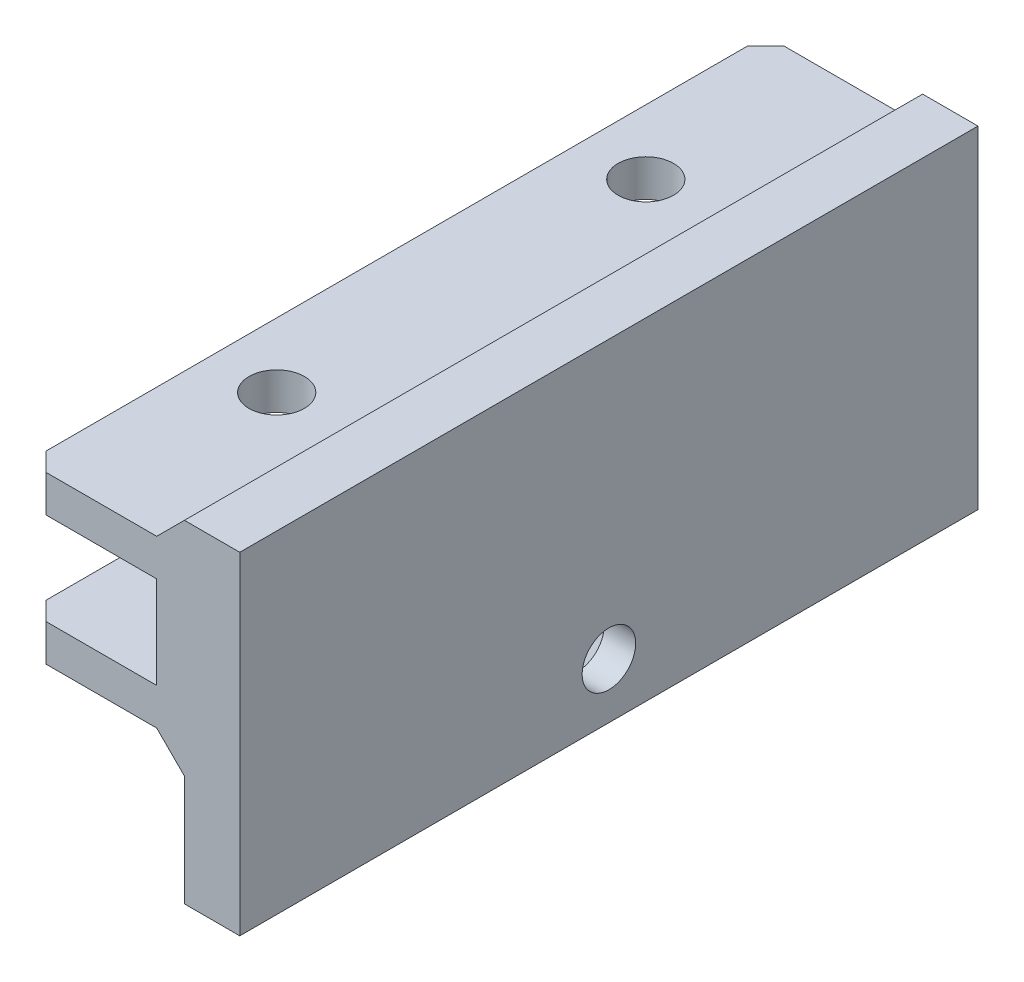
ISO-10303-21;
HEADER;
FILE_DESCRIPTION(('STEP AP214'),'2;1');
FILE_NAME('part.step','',(''),(''),'','','');
FILE_SCHEMA(('AUTOMOTIVE_DESIGN { 1 0 10303 214 1 1 1 1 }'));
ENDSEC;
DATA;
#1=APPLICATION_CONTEXT('core data for automotive mechanical design processes');
#2=APPLICATION_PROTOCOL_DEFINITION('international standard','automotive_design',2000,#1);
#3=PRODUCT_CONTEXT('',#1,'mechanical');
#4=PRODUCT('Part','Part','',(#3));
#5=PRODUCT_RELATED_PRODUCT_CATEGORY('part','',(#4));
#6=PRODUCT_DEFINITION_FORMATION('','',#4);
#7=PRODUCT_DEFINITION_CONTEXT('part definition',#1,'design');
#8=PRODUCT_DEFINITION('design','',#6,#7);
#9=PRODUCT_DEFINITION_SHAPE('','',#8);
#10=(LENGTH_UNIT() NAMED_UNIT(*) SI_UNIT(.MILLI.,.METRE.));
#11=(NAMED_UNIT(*) PLANE_ANGLE_UNIT() SI_UNIT($,.RADIAN.));
#12=(NAMED_UNIT(*) SI_UNIT($,.STERADIAN.) SOLID_ANGLE_UNIT());
#13=UNCERTAINTY_MEASURE_WITH_UNIT(LENGTH_MEASURE(1.E-05),#10,'distance_accuracy_value','');
#14=(GEOMETRIC_REPRESENTATION_CONTEXT(3) GLOBAL_UNCERTAINTY_ASSIGNED_CONTEXT((#13)) GLOBAL_UNIT_ASSIGNED_CONTEXT((#10,
#11,#12)) REPRESENTATION_CONTEXT('',''));
#15=CARTESIAN_POINT('',(0.,0.,0.));
#16=DIRECTION('',(0.,0.,1.));
#17=DIRECTION('',(1.,0.,0.));
#18=AXIS2_PLACEMENT_3D('',#15,#16,#17);
#19=CARTESIAN_POINT('',(0.,6.,20.));
#20=DIRECTION('',(0.,-1.,0.));
#21=DIRECTION('',(0.,0.,-1.));
#22=AXIS2_PLACEMENT_3D('',#19,#20,#21);
#23=PLANE('',#22);
#24=DIRECTION('',(-1.,0.,0.));
#25=VECTOR('',#24,1.);
#26=CARTESIAN_POINT('',(0.,6.,-20.));
#27=LINE('',#26,#25);
#28=CARTESIAN_POINT('',(0.,6.,-20.));
#29=VERTEX_POINT('',#28);
#30=CARTESIAN_POINT('',(-3.00000000000001,6.,-20.));
#31=VERTEX_POINT('',#30);
#32=EDGE_CURVE('E233',#29,#31,#27,.T.);
#33=ORIENTED_EDGE('',*,*,#32,.T.);
#34=DIRECTION('',(0.,0.,-1.));
#35=VECTOR('',#34,1.);
#36=CARTESIAN_POINT('',(-3.00000000000001,6.,20.));
#37=LINE('',#36,#35);
#38=CARTESIAN_POINT('',(-3.00000000000001,6.,20.));
#39=VERTEX_POINT('',#38);
#40=EDGE_CURVE('E329',#39,#31,#37,.T.);
#41=ORIENTED_EDGE('',*,*,#40,.F.);
#42=DIRECTION('',(-1.,0.,0.));
#43=VECTOR('',#42,1.);
#44=CARTESIAN_POINT('',(0.,6.,20.));
#45=LINE('',#44,#43);
#46=CARTESIAN_POINT('',(0.,6.,20.));
#47=VERTEX_POINT('',#46);
#48=EDGE_CURVE('E234',#47,#39,#45,.T.);
#49=ORIENTED_EDGE('',*,*,#48,.F.);
#50=DIRECTION('',(0.,0.,-1.));
#51=VECTOR('',#50,1.);
#52=CARTESIAN_POINT('',(0.,6.,20.));
#53=LINE('',#52,#51);
#54=EDGE_CURVE('E263',#47,#29,#53,.T.);
#55=ORIENTED_EDGE('',*,*,#54,.T.);
#56=EDGE_LOOP('',(#33,#41,#49,#55));
#57=FACE_BOUND('',#56,.T.);
#58=ADVANCED_FACE('F47',(#57),#23,.F.);
#59=CARTESIAN_POINT('',(-3.00000000000001,6.,20.));
#60=DIRECTION('',(0.707106781186549,-0.707106781186546,0.));
#61=DIRECTION('',(0.707106781186546,0.707106781186549,0.));
#62=AXIS2_PLACEMENT_3D('',#59,#60,#61);
#63=PLANE('',#62);
#64=DIRECTION('',(-0.707106781186546,-0.707106781186549,0.));
#65=VECTOR('',#64,1.);
#66=CARTESIAN_POINT('',(-3.00000000000001,6.,-20.));
#67=LINE('',#66,#65);
#68=CARTESIAN_POINT('',(-4.5,4.5,-20.));
#69=VERTEX_POINT('',#68);
#70=EDGE_CURVE('E267',#31,#69,#67,.T.);
#71=ORIENTED_EDGE('',*,*,#70,.T.);
#72=DIRECTION('',(0.,0.,-1.));
#73=VECTOR('',#72,1.);
#74=CARTESIAN_POINT('',(-4.5,4.5,20.));
#75=LINE('',#74,#73);
#76=CARTESIAN_POINT('',(-4.5,4.5,20.));
#77=VERTEX_POINT('',#76);
#78=EDGE_CURVE('E325',#77,#69,#75,.T.);
#79=ORIENTED_EDGE('',*,*,#78,.F.);
#80=DIRECTION('',(-0.707106781186546,-0.707106781186549,0.));
#81=VECTOR('',#80,1.);
#82=CARTESIAN_POINT('',(-3.00000000000001,6.,20.));
#83=LINE('',#82,#81);
#84=EDGE_CURVE('E238',#39,#77,#83,.T.);
#85=ORIENTED_EDGE('',*,*,#84,.F.);
#86=ORIENTED_EDGE('',*,*,#40,.T.);
#87=EDGE_LOOP('',(#71,#79,#85,#86));
#88=FACE_BOUND('',#87,.T.);
#89=ADVANCED_FACE('F428',(#88),#63,.F.);
#90=CARTESIAN_POINT('',(-4.5,4.5,20.));
#91=DIRECTION('',(0.,-1.,0.));
#92=DIRECTION('',(0.,0.,-1.));
#93=AXIS2_PLACEMENT_3D('',#90,#91,#92);
#94=PLANE('',#93);
#95=CARTESIAN_POINT('',(-8.,4.5,10.));
#96=DIRECTION('',(0.,1.,0.));
#97=DIRECTION('',(0.,0.,1.));
#98=AXIS2_PLACEMENT_3D('',#95,#96,#97);
#99=CIRCLE('',#98,1.5);
#100=CARTESIAN_POINT('',(-8.,4.5,11.5));
#101=VERTEX_POINT('',#100);
#102=EDGE_CURVE('E201',#101,#101,#99,.T.);
#103=ORIENTED_EDGE('',*,*,#102,.F.);
#104=EDGE_LOOP('',(#103));
#105=FACE_BOUND('',#104,.T.);
#106=CARTESIAN_POINT('',(-8.,4.5,-10.));
#107=DIRECTION('',(0.,1.,0.));
#108=DIRECTION('',(0.,0.,1.));
#109=AXIS2_PLACEMENT_3D('',#106,#107,#108);
#110=CIRCLE('',#109,1.5);
#111=CARTESIAN_POINT('',(-8.,4.5,-8.5));
#112=VERTEX_POINT('',#111);
#113=EDGE_CURVE('E220',#112,#112,#110,.T.);
#114=ORIENTED_EDGE('',*,*,#113,.F.);
#115=EDGE_LOOP('',(#114));
#116=FACE_BOUND('',#115,.T.);
#117=DIRECTION('',(-1.,0.,0.));
#118=VECTOR('',#117,1.);
#119=CARTESIAN_POINT('',(-4.5,4.5,-20.));
#120=LINE('',#119,#118);
#121=CARTESIAN_POINT('',(-10.5,4.5,-20.));
#122=VERTEX_POINT('',#121);
#123=EDGE_CURVE('E270',#69,#122,#120,.T.);
#124=ORIENTED_EDGE('',*,*,#123,.T.);
#125=DIRECTION('',(0.707106781186548,0.,-0.707106781186548));
#126=VECTOR('',#125,1.);
#127=CARTESIAN_POINT('',(-11.5,4.5,-19.));
#128=LINE('',#127,#126);
#129=CARTESIAN_POINT('',(-11.5,4.5,-19.));
#130=VERTEX_POINT('',#129);
#131=EDGE_CURVE('E378',#122,#130,#128,.F.);
#132=ORIENTED_EDGE('',*,*,#131,.T.);
#133=DIRECTION('',(0.,0.,-1.));
#134=VECTOR('',#133,1.);
#135=CARTESIAN_POINT('',(-11.5,4.5,20.));
#136=LINE('',#135,#134);
#137=CARTESIAN_POINT('',(-11.5,4.5,19.));
#138=VERTEX_POINT('',#137);
#139=EDGE_CURVE('E321',#138,#130,#136,.T.);
#140=ORIENTED_EDGE('',*,*,#139,.F.);
#141=DIRECTION('',(0.707106781186548,0.,0.707106781186548));
#142=VECTOR('',#141,1.);
#143=CARTESIAN_POINT('',(-10.5,4.5,20.));
#144=LINE('',#143,#142);
#145=CARTESIAN_POINT('',(-10.5,4.5,20.));
#146=VERTEX_POINT('',#145);
#147=EDGE_CURVE('E64',#138,#146,#144,.T.);
#148=ORIENTED_EDGE('',*,*,#147,.T.);
#149=DIRECTION('',(-1.,0.,0.));
#150=VECTOR('',#149,1.);
#151=CARTESIAN_POINT('',(-4.5,4.5,20.));
#152=LINE('',#151,#150);
#153=EDGE_CURVE('E241',#77,#146,#152,.T.);
#154=ORIENTED_EDGE('',*,*,#153,.F.);
#155=ORIENTED_EDGE('',*,*,#78,.T.);
#156=EDGE_LOOP('',(#124,#132,#140,#148,#154,#155));
#157=FACE_BOUND('',#156,.T.);
#158=ADVANCED_FACE('F434',(#105,#116,#157),#94,.F.);
#159=CARTESIAN_POINT('',(-11.5,4.5,20.));
#160=DIRECTION('',(1.,0.,0.));
#161=DIRECTION('',(0.,0.,-1.));
#162=AXIS2_PLACEMENT_3D('',#159,#160,#161);
#163=PLANE('',#162);
#164=ORIENTED_EDGE('',*,*,#139,.T.);
#165=DIRECTION('',(0.,-1.,0.));
#166=VECTOR('',#165,1.);
#167=CARTESIAN_POINT('',(-11.5,4.5,-19.));
#168=LINE('',#167,#166);
#169=CARTESIAN_POINT('',(-11.5,2.5,-19.));
#170=VERTEX_POINT('',#169);
#171=EDGE_CURVE('E367',#130,#170,#168,.T.);
#172=ORIENTED_EDGE('',*,*,#171,.T.);
#173=DIRECTION('',(0.,0.,-1.));
#174=VECTOR('',#173,1.);
#175=CARTESIAN_POINT('',(-11.5,2.5,20.));
#176=LINE('',#175,#174);
#177=CARTESIAN_POINT('',(-11.5,2.5,19.));
#178=VERTEX_POINT('',#177);
#179=EDGE_CURVE('E317',#178,#170,#176,.T.);
#180=ORIENTED_EDGE('',*,*,#179,.F.);
#181=DIRECTION('',(0.,1.,0.));
#182=VECTOR('',#181,1.);
#183=CARTESIAN_POINT('',(-11.5,4.5,19.));
#184=LINE('',#183,#182);
#185=EDGE_CURVE('E364',#178,#138,#184,.T.);
#186=ORIENTED_EDGE('',*,*,#185,.T.);
#187=EDGE_LOOP('',(#164,#172,#180,#186));
#188=FACE_BOUND('',#187,.T.);
#189=ADVANCED_FACE('F485',(#188),#163,.F.);
#190=CARTESIAN_POINT('',(-4.5,2.5,20.));
#191=DIRECTION('',(0.,1.,0.));
#192=DIRECTION('',(0.,0.,1.));
#193=AXIS2_PLACEMENT_3D('',#190,#191,#192);
#194=PLANE('',#193);
#195=CARTESIAN_POINT('',(-8.,2.5,10.));
#196=DIRECTION('',(0.,1.,0.));
#197=DIRECTION('',(0.,0.,1.));
#198=AXIS2_PLACEMENT_3D('',#195,#196,#197);
#199=CIRCLE('',#198,1.5);
#200=CARTESIAN_POINT('',(-8.,2.5,11.5));
#201=VERTEX_POINT('',#200);
#202=EDGE_CURVE('E216',#201,#201,#199,.T.);
#203=ORIENTED_EDGE('',*,*,#202,.T.);
#204=EDGE_LOOP('',(#203));
#205=FACE_BOUND('',#204,.T.);
#206=CARTESIAN_POINT('',(-8.,2.5,-10.));
#207=DIRECTION('',(0.,1.,0.));
#208=DIRECTION('',(0.,0.,1.));
#209=AXIS2_PLACEMENT_3D('',#206,#207,#208);
#210=CIRCLE('',#209,1.5);
#211=CARTESIAN_POINT('',(-8.,2.5,-8.5));
#212=VERTEX_POINT('',#211);
#213=EDGE_CURVE('E229',#212,#212,#210,.T.);
#214=ORIENTED_EDGE('',*,*,#213,.T.);
#215=EDGE_LOOP('',(#214));
#216=FACE_BOUND('',#215,.T.);
#217=ORIENTED_EDGE('',*,*,#179,.T.);
#218=DIRECTION('',(-0.707106781186548,0.,0.707106781186548));
#219=VECTOR('',#218,1.);
#220=CARTESIAN_POINT('',(-11.5,2.5,-19.));
#221=LINE('',#220,#219);
#222=CARTESIAN_POINT('',(-10.5,2.5,-20.));
#223=VERTEX_POINT('',#222);
#224=EDGE_CURVE('E373',#170,#223,#221,.F.);
#225=ORIENTED_EDGE('',*,*,#224,.T.);
#226=DIRECTION('',(1.,0.,0.));
#227=VECTOR('',#226,1.);
#228=CARTESIAN_POINT('',(-4.5,2.5,-20.));
#229=LINE('',#228,#227);
#230=CARTESIAN_POINT('',(-4.5,2.5,-20.));
#231=VERTEX_POINT('',#230);
#232=EDGE_CURVE('E274',#223,#231,#229,.T.);
#233=ORIENTED_EDGE('',*,*,#232,.T.);
#234=DIRECTION('',(0.,0.,-1.));
#235=VECTOR('',#234,1.);
#236=CARTESIAN_POINT('',(-4.5,2.5,20.));
#237=LINE('',#236,#235);
#238=CARTESIAN_POINT('',(-4.5,2.5,20.));
#239=VERTEX_POINT('',#238);
#240=EDGE_CURVE('E313',#239,#231,#237,.T.);
#241=ORIENTED_EDGE('',*,*,#240,.F.);
#242=DIRECTION('',(1.,0.,0.));
#243=VECTOR('',#242,1.);
#244=CARTESIAN_POINT('',(-4.5,2.5,20.));
#245=LINE('',#244,#243);
#246=CARTESIAN_POINT('',(-10.5,2.5,20.));
#247=VERTEX_POINT('',#246);
#248=EDGE_CURVE('E244',#247,#239,#245,.T.);
#249=ORIENTED_EDGE('',*,*,#248,.F.);
#250=DIRECTION('',(-0.707106781186548,0.,-0.707106781186548));
#251=VECTOR('',#250,1.);
#252=CARTESIAN_POINT('',(-10.5,2.5,20.));
#253=LINE('',#252,#251);
#254=EDGE_CURVE('E72',#247,#178,#253,.T.);
#255=ORIENTED_EDGE('',*,*,#254,.T.);
#256=EDGE_LOOP('',(#217,#225,#233,#241,#249,#255));
#257=FACE_BOUND('',#256,.T.);
#258=ADVANCED_FACE('F462',(#205,#216,#257),#194,.F.);
#259=CARTESIAN_POINT('',(-4.5,-2.5,20.));
#260=DIRECTION('',(1.,0.,0.));
#261=DIRECTION('',(0.,0.,-1.));
#262=AXIS2_PLACEMENT_3D('',#259,#260,#261);
#263=PLANE('',#262);
#264=DIRECTION('',(0.,-1.,0.));
#265=VECTOR('',#264,1.);
#266=CARTESIAN_POINT('',(-4.5,-2.5,-20.));
#267=LINE('',#266,#265);
#268=CARTESIAN_POINT('',(-4.5,-2.5,-20.));
#269=VERTEX_POINT('',#268);
#270=EDGE_CURVE('E277',#231,#269,#267,.T.);
#271=ORIENTED_EDGE('',*,*,#270,.T.);
#272=DIRECTION('',(0.,0.,-1.));
#273=VECTOR('',#272,1.);
#274=CARTESIAN_POINT('',(-4.5,-2.5,20.));
#275=LINE('',#274,#273);
#276=CARTESIAN_POINT('',(-4.5,-2.5,20.));
#277=VERTEX_POINT('',#276);
#278=EDGE_CURVE('E309',#277,#269,#275,.T.);
#279=ORIENTED_EDGE('',*,*,#278,.F.);
#280=DIRECTION('',(0.,-1.,0.));
#281=VECTOR('',#280,1.);
#282=CARTESIAN_POINT('',(-4.5,-2.5,20.));
#283=LINE('',#282,#281);
#284=EDGE_CURVE('E247',#239,#277,#283,.T.);
#285=ORIENTED_EDGE('',*,*,#284,.F.);
#286=ORIENTED_EDGE('',*,*,#240,.T.);
#287=EDGE_LOOP('',(#271,#279,#285,#286));
#288=FACE_BOUND('',#287,.T.);
#289=ADVANCED_FACE('F469',(#288),#263,.F.);
#290=CARTESIAN_POINT('',(-4.5,-2.5,20.));
#291=DIRECTION('',(0.,-1.,0.));
#292=DIRECTION('',(0.,0.,-1.));
#293=AXIS2_PLACEMENT_3D('',#290,#291,#292);
#294=PLANE('',#293);
#295=CARTESIAN_POINT('',(-8.,-2.5,10.));
#296=DIRECTION('',(0.,-1.,0.));
#297=DIRECTION('',(0.,0.,-1.));
#298=AXIS2_PLACEMENT_3D('',#295,#296,#297);
#299=CIRCLE('',#298,1.5);
#300=CARTESIAN_POINT('',(-8.,-2.5,8.5));
#301=VERTEX_POINT('',#300);
#302=EDGE_CURVE('E212',#301,#301,#299,.T.);
#303=ORIENTED_EDGE('',*,*,#302,.T.);
#304=EDGE_LOOP('',(#303));
#305=FACE_BOUND('',#304,.T.);
#306=CARTESIAN_POINT('',(-8.,-2.5,-10.));
#307=DIRECTION('',(0.,-1.,0.));
#308=DIRECTION('',(0.,0.,-1.));
#309=AXIS2_PLACEMENT_3D('',#306,#307,#308);
#310=CIRCLE('',#309,1.5);
#311=CARTESIAN_POINT('',(-8.,-2.5,-11.5));
#312=VERTEX_POINT('',#311);
#313=EDGE_CURVE('E225',#312,#312,#310,.T.);
#314=ORIENTED_EDGE('',*,*,#313,.T.);
#315=EDGE_LOOP('',(#314));
#316=FACE_BOUND('',#315,.T.);
#317=DIRECTION('',(-1.,0.,0.));
#318=VECTOR('',#317,1.);
#319=CARTESIAN_POINT('',(-4.5,-2.5,-20.));
#320=LINE('',#319,#318);
#321=CARTESIAN_POINT('',(-10.5,-2.5,-20.));
#322=VERTEX_POINT('',#321);
#323=EDGE_CURVE('E280',#269,#322,#320,.T.);
#324=ORIENTED_EDGE('',*,*,#323,.T.);
#325=DIRECTION('',(0.707106781186548,0.,-0.707106781186548));
#326=VECTOR('',#325,1.);
#327=CARTESIAN_POINT('',(-11.5,-2.5,-19.));
#328=LINE('',#327,#326);
#329=CARTESIAN_POINT('',(-11.5,-2.5,-19.));
#330=VERTEX_POINT('',#329);
#331=EDGE_CURVE('E361',#322,#330,#328,.F.);
#332=ORIENTED_EDGE('',*,*,#331,.T.);
#333=DIRECTION('',(0.,0.,-1.));
#334=VECTOR('',#333,1.);
#335=CARTESIAN_POINT('',(-11.5,-2.5,20.));
#336=LINE('',#335,#334);
#337=CARTESIAN_POINT('',(-11.5,-2.5,19.));
#338=VERTEX_POINT('',#337);
#339=EDGE_CURVE('E305',#338,#330,#336,.T.);
#340=ORIENTED_EDGE('',*,*,#339,.F.);
#341=DIRECTION('',(0.707106781186548,0.,0.707106781186548));
#342=VECTOR('',#341,1.);
#343=CARTESIAN_POINT('',(-10.5,-2.5,20.));
#344=LINE('',#343,#342);
#345=CARTESIAN_POINT('',(-10.5,-2.5,20.));
#346=VERTEX_POINT('',#345);
#347=EDGE_CURVE('E358',#338,#346,#344,.T.);
#348=ORIENTED_EDGE('',*,*,#347,.T.);
#349=DIRECTION('',(-1.,0.,0.));
#350=VECTOR('',#349,1.);
#351=CARTESIAN_POINT('',(-4.5,-2.5,20.));
#352=LINE('',#351,#350);
#353=EDGE_CURVE('E250',#277,#346,#352,.T.);
#354=ORIENTED_EDGE('',*,*,#353,.F.);
#355=ORIENTED_EDGE('',*,*,#278,.T.);
#356=EDGE_LOOP('',(#324,#332,#340,#348,#354,#355));
#357=FACE_BOUND('',#356,.T.);
#358=ADVANCED_FACE('F472',(#305,#316,#357),#294,.F.);
#359=CARTESIAN_POINT('',(-11.5,-4.5,20.));
#360=DIRECTION('',(1.,0.,0.));
#361=DIRECTION('',(0.,0.,-1.));
#362=AXIS2_PLACEMENT_3D('',#359,#360,#361);
#363=PLANE('',#362);
#364=ORIENTED_EDGE('',*,*,#339,.T.);
#365=DIRECTION('',(0.,-1.,0.));
#366=VECTOR('',#365,1.);
#367=CARTESIAN_POINT('',(-11.5,-4.5,-19.));
#368=LINE('',#367,#366);
#369=CARTESIAN_POINT('',(-11.5,-4.5,-19.));
#370=VERTEX_POINT('',#369);
#371=EDGE_CURVE('E342',#330,#370,#368,.T.);
#372=ORIENTED_EDGE('',*,*,#371,.T.);
#373=DIRECTION('',(0.,0.,-1.));
#374=VECTOR('',#373,1.);
#375=CARTESIAN_POINT('',(-11.5,-4.5,20.));
#376=LINE('',#375,#374);
#377=CARTESIAN_POINT('',(-11.5,-4.5,19.));
#378=VERTEX_POINT('',#377);
#379=EDGE_CURVE('E301',#378,#370,#376,.T.);
#380=ORIENTED_EDGE('',*,*,#379,.F.);
#381=DIRECTION('',(0.,1.,0.));
#382=VECTOR('',#381,1.);
#383=CARTESIAN_POINT('',(-11.5,-2.5,19.));
#384=LINE('',#383,#382);
#385=EDGE_CURVE('E333',#378,#338,#384,.T.);
#386=ORIENTED_EDGE('',*,*,#385,.T.);
#387=EDGE_LOOP('',(#364,#372,#380,#386));
#388=FACE_BOUND('',#387,.T.);
#389=ADVANCED_FACE('F476',(#388),#363,.F.);
#390=CARTESIAN_POINT('',(-4.5,-4.5,20.));
#391=DIRECTION('',(0.,1.,0.));
#392=DIRECTION('',(0.,0.,1.));
#393=AXIS2_PLACEMENT_3D('',#390,#391,#392);
#394=PLANE('',#393);
#395=CARTESIAN_POINT('',(-8.,-4.5,10.));
#396=DIRECTION('',(0.,1.,0.));
#397=DIRECTION('',(0.,0.,1.));
#398=AXIS2_PLACEMENT_3D('',#395,#396,#397);
#399=CIRCLE('',#398,1.5);
#400=CARTESIAN_POINT('',(-8.,-4.5,11.5));
#401=VERTEX_POINT('',#400);
#402=EDGE_CURVE('E207',#401,#401,#399,.T.);
#403=ORIENTED_EDGE('',*,*,#402,.T.);
#404=EDGE_LOOP('',(#403));
#405=FACE_BOUND('',#404,.T.);
#406=CARTESIAN_POINT('',(-8.,-4.5,-10.));
#407=DIRECTION('',(0.,1.,0.));
#408=DIRECTION('',(0.,0.,1.));
#409=AXIS2_PLACEMENT_3D('',#406,#407,#408);
#410=CIRCLE('',#409,1.5);
#411=CARTESIAN_POINT('',(-8.,-4.5,-8.5));
#412=VERTEX_POINT('',#411);
#413=EDGE_CURVE('E224',#412,#412,#410,.T.);
#414=ORIENTED_EDGE('',*,*,#413,.T.);
#415=EDGE_LOOP('',(#414));
#416=FACE_BOUND('',#415,.T.);
#417=ORIENTED_EDGE('',*,*,#379,.T.);
#418=DIRECTION('',(-0.707106781186548,0.,0.707106781186548));
#419=VECTOR('',#418,1.);
#420=CARTESIAN_POINT('',(-11.5,-4.5,-19.));
#421=LINE('',#420,#419);
#422=CARTESIAN_POINT('',(-10.5,-4.5,-20.));
#423=VERTEX_POINT('',#422);
#424=EDGE_CURVE('E349',#370,#423,#421,.F.);
#425=ORIENTED_EDGE('',*,*,#424,.T.);
#426=DIRECTION('',(1.,0.,0.));
#427=VECTOR('',#426,1.);
#428=CARTESIAN_POINT('',(-4.5,-4.5,-20.));
#429=LINE('',#428,#427);
#430=CARTESIAN_POINT('',(-4.5,-4.5,-20.));
#431=VERTEX_POINT('',#430);
#432=EDGE_CURVE('E284',#423,#431,#429,.T.);
#433=ORIENTED_EDGE('',*,*,#432,.T.);
#434=DIRECTION('',(0.,0.,-1.));
#435=VECTOR('',#434,1.);
#436=CARTESIAN_POINT('',(-4.5,-4.5,20.));
#437=LINE('',#436,#435);
#438=CARTESIAN_POINT('',(-4.5,-4.5,20.));
#439=VERTEX_POINT('',#438);
#440=EDGE_CURVE('E297',#439,#431,#437,.T.);
#441=ORIENTED_EDGE('',*,*,#440,.F.);
#442=DIRECTION('',(1.,0.,0.));
#443=VECTOR('',#442,1.);
#444=CARTESIAN_POINT('',(-4.5,-4.5,20.));
#445=LINE('',#444,#443);
#446=CARTESIAN_POINT('',(-10.5,-4.5,20.));
#447=VERTEX_POINT('',#446);
#448=EDGE_CURVE('E254',#447,#439,#445,.T.);
#449=ORIENTED_EDGE('',*,*,#448,.F.);
#450=DIRECTION('',(-0.707106781186548,0.,-0.707106781186548));
#451=VECTOR('',#450,1.);
#452=CARTESIAN_POINT('',(-10.5,-4.5,20.));
#453=LINE('',#452,#451);
#454=EDGE_CURVE('E346',#447,#378,#453,.T.);
#455=ORIENTED_EDGE('',*,*,#454,.T.);
#456=EDGE_LOOP('',(#417,#425,#433,#441,#449,#455));
#457=FACE_BOUND('',#456,.T.);
#458=ADVANCED_FACE('F391',(#405,#416,#457),#394,.F.);
#459=CARTESIAN_POINT('',(-3.00000000000001,-6.,20.));
#460=DIRECTION('',(0.707106781186549,0.707106781186546,0.));
#461=DIRECTION('',(-0.707106781186546,0.707106781186549,0.));
#462=AXIS2_PLACEMENT_3D('',#459,#460,#461);
#463=PLANE('',#462);
#464=DIRECTION('',(0.707106781186546,-0.707106781186549,0.));
#465=VECTOR('',#464,1.);
#466=CARTESIAN_POINT('',(-3.00000000000001,-6.,-20.));
#467=LINE('',#466,#465);
#468=CARTESIAN_POINT('',(-3.00000000000001,-6.,-20.));
#469=VERTEX_POINT('',#468);
#470=EDGE_CURVE('E287',#431,#469,#467,.T.);
#471=ORIENTED_EDGE('',*,*,#470,.T.);
#472=DIRECTION('',(0.,0.,-1.));
#473=VECTOR('',#472,1.);
#474=CARTESIAN_POINT('',(-3.00000000000001,-6.,20.));
#475=LINE('',#474,#473);
#476=CARTESIAN_POINT('',(-3.00000000000001,-6.,20.));
#477=VERTEX_POINT('',#476);
#478=EDGE_CURVE('E199',#477,#469,#475,.T.);
#479=ORIENTED_EDGE('',*,*,#478,.F.);
#480=DIRECTION('',(0.707106781186546,-0.707106781186549,0.));
#481=VECTOR('',#480,1.);
#482=CARTESIAN_POINT('',(-3.00000000000001,-6.,20.));
#483=LINE('',#482,#481);
#484=EDGE_CURVE('E257',#439,#477,#483,.T.);
#485=ORIENTED_EDGE('',*,*,#484,.F.);
#486=ORIENTED_EDGE('',*,*,#440,.T.);
#487=EDGE_LOOP('',(#471,#479,#485,#486));
#488=FACE_BOUND('',#487,.T.);
#489=ADVANCED_FACE('F395',(#488),#463,.F.);
#490=CARTESIAN_POINT('',(0.,-6.,20.));
#491=DIRECTION('',(-1.,0.,0.));
#492=DIRECTION('',(0.,0.,1.));
#493=AXIS2_PLACEMENT_3D('',#490,#491,#492);
#494=PLANE('',#493);
#495=CARTESIAN_POINT('',(0.,-9.,0.));
#496=DIRECTION('',(-1.,0.,0.));
#497=DIRECTION('',(0.,0.,1.));
#498=AXIS2_PLACEMENT_3D('',#495,#496,#497);
#499=CIRCLE('',#498,1.45);
#500=CARTESIAN_POINT('',(0.,-9.,1.45));
#501=VERTEX_POINT('',#500);
#502=EDGE_CURVE('E195',#501,#501,#499,.T.);
#503=ORIENTED_EDGE('',*,*,#502,.T.);
#504=EDGE_LOOP('',(#503));
#505=FACE_BOUND('',#504,.T.);
#506=DIRECTION('',(0.,1.,0.));
#507=VECTOR('',#506,1.);
#508=CARTESIAN_POINT('',(0.,-6.,-20.));
#509=LINE('',#508,#507);
#510=CARTESIAN_POINT('',(0.,-12.,-20.));
#511=VERTEX_POINT('',#510);
#512=EDGE_CURVE('E179',#511,#29,#509,.T.);
#513=ORIENTED_EDGE('',*,*,#512,.T.);
#514=ORIENTED_EDGE('',*,*,#54,.F.);
#515=DIRECTION('',(0.,1.,0.));
#516=VECTOR('',#515,1.);
#517=CARTESIAN_POINT('',(0.,-6.,20.));
#518=LINE('',#517,#516);
#519=CARTESIAN_POINT('',(0.,-12.,20.));
#520=VERTEX_POINT('',#519);
#521=EDGE_CURVE('E260',#520,#47,#518,.T.);
#522=ORIENTED_EDGE('',*,*,#521,.F.);
#523=DIRECTION('',(0.,0.,1.));
#524=VECTOR('',#523,1.);
#525=CARTESIAN_POINT('',(0.,-12.,-20.));
#526=LINE('',#525,#524);
#527=EDGE_CURVE('E184',#511,#520,#526,.T.);
#528=ORIENTED_EDGE('',*,*,#527,.F.);
#529=EDGE_LOOP('',(#513,#514,#522,#528));
#530=FACE_BOUND('',#529,.T.);
#531=ADVANCED_FACE('F508',(#505,#530),#494,.F.);
#532=CARTESIAN_POINT('',(0.,0.,20.));
#533=DIRECTION('',(0.,0.,1.));
#534=DIRECTION('',(1.,0.,0.));
#535=AXIS2_PLACEMENT_3D('',#532,#533,#534);
#536=PLANE('',#535);
#537=ORIENTED_EDGE('',*,*,#153,.T.);
#538=DIRECTION('',(0.,-1.,0.));
#539=VECTOR('',#538,1.);
#540=CARTESIAN_POINT('',(-10.5,2.5,20.));
#541=LINE('',#540,#539);
#542=EDGE_CURVE('E11',#146,#247,#541,.T.);
#543=ORIENTED_EDGE('',*,*,#542,.T.);
#544=ORIENTED_EDGE('',*,*,#248,.T.);
#545=ORIENTED_EDGE('',*,*,#284,.T.);
#546=ORIENTED_EDGE('',*,*,#353,.T.);
#547=DIRECTION('',(0.,-1.,0.));
#548=VECTOR('',#547,1.);
#549=CARTESIAN_POINT('',(-10.5,-4.5,20.));
#550=LINE('',#549,#548);
#551=EDGE_CURVE('E57',#346,#447,#550,.T.);
#552=ORIENTED_EDGE('',*,*,#551,.T.);
#553=ORIENTED_EDGE('',*,*,#448,.T.);
#554=ORIENTED_EDGE('',*,*,#484,.T.);
#555=DIRECTION('',(0.,1.,0.));
#556=VECTOR('',#555,1.);
#557=CARTESIAN_POINT('',(-3.00000000000001,-12.,20.));
#558=LINE('',#557,#556);
#559=CARTESIAN_POINT('',(-3.00000000000001,-12.,20.));
#560=VERTEX_POINT('',#559);
#561=EDGE_CURVE('E202',#560,#477,#558,.T.);
#562=ORIENTED_EDGE('',*,*,#561,.F.);
#563=DIRECTION('',(-1.,0.,0.));
#564=VECTOR('',#563,1.);
#565=CARTESIAN_POINT('',(0.,-12.,20.));
#566=LINE('',#565,#564);
#567=EDGE_CURVE('E190',#520,#560,#566,.T.);
#568=ORIENTED_EDGE('',*,*,#567,.F.);
#569=ORIENTED_EDGE('',*,*,#521,.T.);
#570=ORIENTED_EDGE('',*,*,#48,.T.);
#571=ORIENTED_EDGE('',*,*,#84,.T.);
#572=EDGE_LOOP('',(#537,#543,#544,#545,#546,#552,#553,#554,#562,#568,#569,#570,#571));
#573=FACE_BOUND('',#572,.T.);
#574=ADVANCED_FACE('F385',(#573),#536,.T.);
#575=CARTESIAN_POINT('',(0.,0.,-20.));
#576=DIRECTION('',(0.,0.,1.));
#577=DIRECTION('',(1.,0.,0.));
#578=AXIS2_PLACEMENT_3D('',#575,#576,#577);
#579=PLANE('',#578);
#580=ORIENTED_EDGE('',*,*,#432,.F.);
#581=DIRECTION('',(0.,1.,0.));
#582=VECTOR('',#581,1.);
#583=CARTESIAN_POINT('',(-10.5,0.,-20.));
#584=LINE('',#583,#582);
#585=EDGE_CURVE('E355',#423,#322,#584,.T.);
#586=ORIENTED_EDGE('',*,*,#585,.T.);
#587=ORIENTED_EDGE('',*,*,#323,.F.);
#588=ORIENTED_EDGE('',*,*,#270,.F.);
#589=ORIENTED_EDGE('',*,*,#232,.F.);
#590=DIRECTION('',(0.,1.,0.));
#591=VECTOR('',#590,1.);
#592=CARTESIAN_POINT('',(-10.5,0.,-20.));
#593=LINE('',#592,#591);
#594=EDGE_CURVE('E352',#223,#122,#593,.T.);
#595=ORIENTED_EDGE('',*,*,#594,.T.);
#596=ORIENTED_EDGE('',*,*,#123,.F.);
#597=ORIENTED_EDGE('',*,*,#70,.F.);
#598=ORIENTED_EDGE('',*,*,#32,.F.);
#599=ORIENTED_EDGE('',*,*,#512,.F.);
#600=DIRECTION('',(1.,0.,0.));
#601=VECTOR('',#600,1.);
#602=CARTESIAN_POINT('',(-3.00000000000001,-12.,-20.));
#603=LINE('',#602,#601);
#604=CARTESIAN_POINT('',(-3.00000000000001,-12.,-20.));
#605=VERTEX_POINT('',#604);
#606=EDGE_CURVE('E170',#605,#511,#603,.T.);
#607=ORIENTED_EDGE('',*,*,#606,.F.);
#608=DIRECTION('',(0.,1.,0.));
#609=VECTOR('',#608,1.);
#610=CARTESIAN_POINT('',(-3.00000000000001,-12.,-20.));
#611=LINE('',#610,#609);
#612=EDGE_CURVE('E176',#605,#469,#611,.T.);
#613=ORIENTED_EDGE('',*,*,#612,.T.);
#614=ORIENTED_EDGE('',*,*,#470,.F.);
#615=EDGE_LOOP('',(#580,#586,#587,#588,#589,#595,#596,#597,#598,#599,#607,#613,#614));
#616=FACE_BOUND('',#615,.T.);
#617=ADVANCED_FACE('F173',(#616),#579,.F.);
#618=CARTESIAN_POINT('',(-8.,4.5,-10.));
#619=DIRECTION('',(0.,1.,0.));
#620=DIRECTION('',(0.,0.,1.));
#621=AXIS2_PLACEMENT_3D('',#618,#619,#620);
#622=CYLINDRICAL_SURFACE('',#621,1.5);
#623=ORIENTED_EDGE('',*,*,#413,.F.);
#624=EDGE_LOOP('',(#623));
#625=FACE_BOUND('',#624,.T.);
#626=ORIENTED_EDGE('',*,*,#313,.F.);
#627=EDGE_LOOP('',(#626));
#628=FACE_BOUND('',#627,.T.);
#629=ADVANCED_FACE('F513',(#625,#628),#622,.F.);
#630=ORIENTED_EDGE('',*,*,#113,.T.);
#631=EDGE_LOOP('',(#630));
#632=FACE_BOUND('',#631,.T.);
#633=ORIENTED_EDGE('',*,*,#213,.F.);
#634=EDGE_LOOP('',(#633));
#635=FACE_BOUND('',#634,.T.);
#636=ADVANCED_FACE('F516',(#632,#635),#622,.F.);
#637=CARTESIAN_POINT('',(-8.,4.5,10.));
#638=DIRECTION('',(0.,1.,0.));
#639=DIRECTION('',(0.,0.,1.));
#640=AXIS2_PLACEMENT_3D('',#637,#638,#639);
#641=CYLINDRICAL_SURFACE('',#640,1.5);
#642=ORIENTED_EDGE('',*,*,#402,.F.);
#643=EDGE_LOOP('',(#642));
#644=FACE_BOUND('',#643,.T.);
#645=ORIENTED_EDGE('',*,*,#302,.F.);
#646=EDGE_LOOP('',(#645));
#647=FACE_BOUND('',#646,.T.);
#648=ADVANCED_FACE('F518',(#644,#647),#641,.F.);
#649=ORIENTED_EDGE('',*,*,#102,.T.);
#650=EDGE_LOOP('',(#649));
#651=FACE_BOUND('',#650,.T.);
#652=ORIENTED_EDGE('',*,*,#202,.F.);
#653=EDGE_LOOP('',(#652));
#654=FACE_BOUND('',#653,.T.);
#655=ADVANCED_FACE('F447',(#651,#654),#641,.F.);
#656=CARTESIAN_POINT('',(-11.5,-4.5,-19.));
#657=DIRECTION('',(0.707106781186547,0.,0.707106781186547));
#658=DIRECTION('',(0.,-1.,0.));
#659=AXIS2_PLACEMENT_3D('',#656,#657,#658);
#660=PLANE('',#659);
#661=ORIENTED_EDGE('',*,*,#331,.F.);
#662=ORIENTED_EDGE('',*,*,#585,.F.);
#663=ORIENTED_EDGE('',*,*,#424,.F.);
#664=ORIENTED_EDGE('',*,*,#371,.F.);
#665=EDGE_LOOP('',(#661,#662,#663,#664));
#666=FACE_BOUND('',#665,.T.);
#667=ADVANCED_FACE('F440',(#666),#660,.F.);
#668=CARTESIAN_POINT('',(-11.5,4.5,-19.));
#669=DIRECTION('',(0.707106781186547,0.,0.707106781186547));
#670=DIRECTION('',(0.,-1.,0.));
#671=AXIS2_PLACEMENT_3D('',#668,#669,#670);
#672=PLANE('',#671);
#673=ORIENTED_EDGE('',*,*,#131,.F.);
#674=ORIENTED_EDGE('',*,*,#594,.F.);
#675=ORIENTED_EDGE('',*,*,#224,.F.);
#676=ORIENTED_EDGE('',*,*,#171,.F.);
#677=EDGE_LOOP('',(#673,#674,#675,#676));
#678=FACE_BOUND('',#677,.T.);
#679=ADVANCED_FACE('F446',(#678),#672,.F.);
#680=CARTESIAN_POINT('',(-10.5,0.,20.));
#681=DIRECTION('',(-0.707106781186547,0.,0.707106781186547));
#682=DIRECTION('',(0.,1.,0.));
#683=AXIS2_PLACEMENT_3D('',#680,#681,#682);
#684=PLANE('',#683);
#685=ORIENTED_EDGE('',*,*,#147,.F.);
#686=ORIENTED_EDGE('',*,*,#185,.F.);
#687=ORIENTED_EDGE('',*,*,#254,.F.);
#688=ORIENTED_EDGE('',*,*,#542,.F.);
#689=EDGE_LOOP('',(#685,#686,#687,#688));
#690=FACE_BOUND('',#689,.T.);
#691=ADVANCED_FACE('F425',(#690),#684,.T.);
#692=CARTESIAN_POINT('',(-10.5,0.,20.));
#693=DIRECTION('',(-0.707106781186547,0.,0.707106781186547));
#694=DIRECTION('',(0.,1.,0.));
#695=AXIS2_PLACEMENT_3D('',#692,#693,#694);
#696=PLANE('',#695);
#697=ORIENTED_EDGE('',*,*,#347,.F.);
#698=ORIENTED_EDGE('',*,*,#385,.F.);
#699=ORIENTED_EDGE('',*,*,#454,.F.);
#700=ORIENTED_EDGE('',*,*,#551,.F.);
#701=EDGE_LOOP('',(#697,#698,#699,#700));
#702=FACE_BOUND('',#701,.T.);
#703=ADVANCED_FACE('F50',(#702),#696,.T.);
#704=CARTESIAN_POINT('',(-3.00000000000001,-12.,20.));
#705=DIRECTION('',(1.,0.,0.));
#706=DIRECTION('',(0.,0.,-1.));
#707=AXIS2_PLACEMENT_3D('',#704,#705,#706);
#708=PLANE('',#707);
#709=CARTESIAN_POINT('',(-3.00000000000001,-9.,0.));
#710=DIRECTION('',(-1.,0.,0.));
#711=DIRECTION('',(0.,0.,1.));
#712=AXIS2_PLACEMENT_3D('',#709,#710,#711);
#713=CIRCLE('',#712,2.75);
#714=CARTESIAN_POINT('',(-3.00000000000001,-9.,2.75));
#715=VERTEX_POINT('',#714);
#716=EDGE_CURVE('E408',#715,#715,#713,.T.);
#717=ORIENTED_EDGE('',*,*,#716,.F.);
#718=EDGE_LOOP('',(#717));
#719=FACE_BOUND('',#718,.T.);
#720=ORIENTED_EDGE('',*,*,#478,.T.);
#721=ORIENTED_EDGE('',*,*,#612,.F.);
#722=DIRECTION('',(0.,0.,-1.));
#723=VECTOR('',#722,1.);
#724=CARTESIAN_POINT('',(-3.00000000000001,-12.,20.));
#725=LINE('',#724,#723);
#726=EDGE_CURVE('E185',#560,#605,#725,.T.);
#727=ORIENTED_EDGE('',*,*,#726,.F.);
#728=ORIENTED_EDGE('',*,*,#561,.T.);
#729=EDGE_LOOP('',(#720,#721,#727,#728));
#730=FACE_BOUND('',#729,.T.);
#731=ADVANCED_FACE('F197',(#719,#730),#708,.F.);
#732=CARTESIAN_POINT('',(0.,-12.,0.));
#733=DIRECTION('',(0.,-1.,0.));
#734=DIRECTION('',(0.,0.,-1.));
#735=AXIS2_PLACEMENT_3D('',#732,#733,#734);
#736=PLANE('',#735);
#737=ORIENTED_EDGE('',*,*,#726,.T.);
#738=ORIENTED_EDGE('',*,*,#606,.T.);
#739=ORIENTED_EDGE('',*,*,#527,.T.);
#740=ORIENTED_EDGE('',*,*,#567,.T.);
#741=EDGE_LOOP('',(#737,#738,#739,#740));
#742=FACE_BOUND('',#741,.T.);
#743=ADVANCED_FACE('F188',(#742),#736,.T.);
#744=CARTESIAN_POINT('',(-3.00000000000001,-9.,0.));
#745=DIRECTION('',(-1.,0.,0.));
#746=DIRECTION('',(0.,0.,1.));
#747=AXIS2_PLACEMENT_3D('',#744,#745,#746);
#748=CYLINDRICAL_SURFACE('',#747,1.45);
#749=ORIENTED_EDGE('',*,*,#502,.F.);
#750=EDGE_LOOP('',(#749));
#751=FACE_BOUND('',#750,.T.);
#752=CARTESIAN_POINT('',(-1.70000000000001,-9.,0.));
#753=DIRECTION('',(-1.,0.,0.));
#754=DIRECTION('',(0.,0.,1.));
#755=AXIS2_PLACEMENT_3D('',#752,#753,#754);
#756=CIRCLE('',#755,1.45);
#757=CARTESIAN_POINT('',(-1.70000000000001,-9.,1.45));
#758=VERTEX_POINT('',#757);
#759=EDGE_CURVE('E404',#758,#758,#756,.T.);
#760=ORIENTED_EDGE('',*,*,#759,.T.);
#761=EDGE_LOOP('',(#760));
#762=FACE_BOUND('',#761,.T.);
#763=ADVANCED_FACE('F422',(#751,#762),#748,.F.);
#764=CARTESIAN_POINT('',(-3.00000000000001,-9.,0.));
#765=DIRECTION('',(-1.,0.,0.));
#766=DIRECTION('',(0.,0.,1.));
#767=AXIS2_PLACEMENT_3D('',#764,#765,#766);
#768=CONICAL_SURFACE('',#767,2.75,0.785398163397449);
#769=ORIENTED_EDGE('',*,*,#759,.F.);
#770=EDGE_LOOP('',(#769));
#771=FACE_BOUND('',#770,.T.);
#772=ORIENTED_EDGE('',*,*,#716,.T.);
#773=EDGE_LOOP('',(#772));
#774=FACE_BOUND('',#773,.T.);
#775=ADVANCED_FACE('F413',(#771,#774),#768,.F.);
#776=CLOSED_SHELL('',(#58,#89,#158,#189,#258,#289,#358,#389,#458,#489,#531,#574,#617,#629,#636,
#648,#655,#667,#679,#691,#703,#731,#743,#763,#775));
#777=MANIFOLD_SOLID_BREP('B2',#776);
#778=ADVANCED_BREP_SHAPE_REPRESENTATION('',(#18,#777),#14);
#779=SHAPE_DEFINITION_REPRESENTATION(#9,#778);
ENDSEC;
END-ISO-10303-21;
